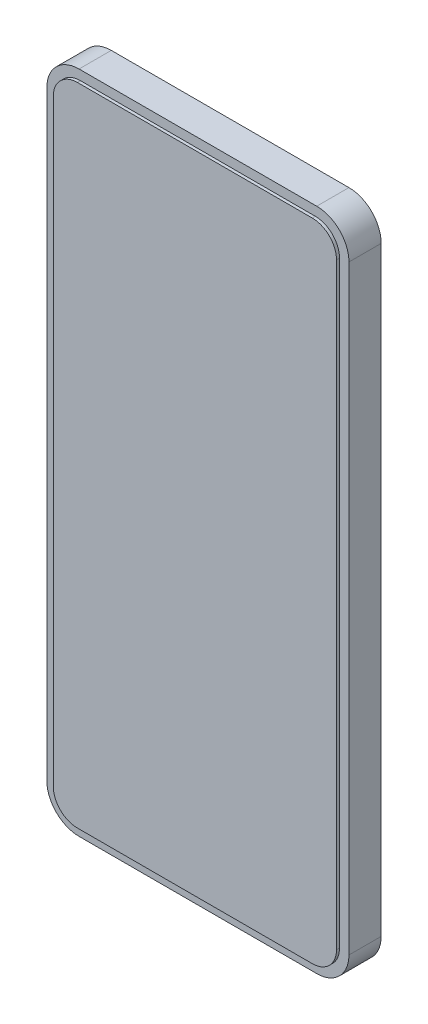
ISO-10303-21;
HEADER;
FILE_DESCRIPTION(('STEP AP214'),'2;1');
FILE_NAME('part.step','',(''),(''),'','','');
FILE_SCHEMA(('AUTOMOTIVE_DESIGN { 1 0 10303 214 1 1 1 1 }'));
ENDSEC;
DATA;
#1=APPLICATION_CONTEXT('core data for automotive mechanical design processes');
#2=APPLICATION_PROTOCOL_DEFINITION('international standard','automotive_design',2000,#1);
#3=PRODUCT_CONTEXT('',#1,'mechanical');
#4=PRODUCT('Part','Part','',(#3));
#5=PRODUCT_RELATED_PRODUCT_CATEGORY('part','',(#4));
#6=PRODUCT_DEFINITION_FORMATION('','',#4);
#7=PRODUCT_DEFINITION_CONTEXT('part definition',#1,'design');
#8=PRODUCT_DEFINITION('design','',#6,#7);
#9=PRODUCT_DEFINITION_SHAPE('','',#8);
#10=(LENGTH_UNIT() NAMED_UNIT(*) SI_UNIT(.MILLI.,.METRE.));
#11=(NAMED_UNIT(*) PLANE_ANGLE_UNIT() SI_UNIT($,.RADIAN.));
#12=(NAMED_UNIT(*) SI_UNIT($,.STERADIAN.) SOLID_ANGLE_UNIT());
#13=UNCERTAINTY_MEASURE_WITH_UNIT(LENGTH_MEASURE(1.E-05),#10,'distance_accuracy_value','');
#14=(GEOMETRIC_REPRESENTATION_CONTEXT(3) GLOBAL_UNCERTAINTY_ASSIGNED_CONTEXT((#13)) GLOBAL_UNIT_ASSIGNED_CONTEXT((#10,
#11,#12)) REPRESENTATION_CONTEXT('',''));
#15=CARTESIAN_POINT('',(0.,0.,0.));
#16=DIRECTION('',(0.,0.,1.));
#17=DIRECTION('',(1.,0.,0.));
#18=AXIS2_PLACEMENT_3D('',#15,#16,#17);
#19=CARTESIAN_POINT('',(0.,0.,8.));
#20=DIRECTION('',(0.,0.,-1.));
#21=DIRECTION('',(-1.,0.,0.));
#22=AXIS2_PLACEMENT_3D('',#19,#20,#21);
#23=PLANE('',#22);
#24=CARTESIAN_POINT('',(29.5,74.5,8.));
#25=DIRECTION('',(0.,0.,-1.));
#26=DIRECTION('',(-1.,0.,0.));
#27=AXIS2_PLACEMENT_3D('',#24,#25,#26);
#28=CIRCLE('',#27,8.);
#29=CARTESIAN_POINT('',(37.5,74.5,8.));
#30=VERTEX_POINT('',#29);
#31=CARTESIAN_POINT('',(35.1568542494924,80.1568542494924,8.));
#32=VERTEX_POINT('',#31);
#33=EDGE_CURVE('E436',#30,#32,#28,.F.);
#34=ORIENTED_EDGE('',*,*,#33,.T.);
#35=CARTESIAN_POINT('',(29.5,82.5,8.));
#36=VERTEX_POINT('',#35);
#37=EDGE_CURVE('E435',#32,#36,#28,.F.);
#38=ORIENTED_EDGE('',*,*,#37,.T.);
#39=DIRECTION('',(-1.,0.,0.));
#40=VECTOR('',#39,1.);
#41=CARTESIAN_POINT('',(-37.5,82.5,8.));
#42=LINE('',#41,#40);
#43=CARTESIAN_POINT('',(-29.5,82.5,8.));
#44=VERTEX_POINT('',#43);
#45=EDGE_CURVE('E400',#36,#44,#42,.T.);
#46=ORIENTED_EDGE('',*,*,#45,.T.);
#47=CARTESIAN_POINT('',(-29.5,74.5,8.));
#48=DIRECTION('',(0.,0.,-1.));
#49=DIRECTION('',(-1.,0.,0.));
#50=AXIS2_PLACEMENT_3D('',#47,#48,#49);
#51=CIRCLE('',#50,8.);
#52=CARTESIAN_POINT('',(-35.1568542494924,80.1568542494924,8.));
#53=VERTEX_POINT('',#52);
#54=EDGE_CURVE('E235',#44,#53,#51,.F.);
#55=ORIENTED_EDGE('',*,*,#54,.T.);
#56=CARTESIAN_POINT('',(-37.5,74.5,8.));
#57=VERTEX_POINT('',#56);
#58=EDGE_CURVE('E237',#53,#57,#51,.F.);
#59=ORIENTED_EDGE('',*,*,#58,.T.);
#60=DIRECTION('',(0.,-1.,0.));
#61=VECTOR('',#60,1.);
#62=CARTESIAN_POINT('',(-37.5,-82.5,8.));
#63=LINE('',#62,#61);
#64=CARTESIAN_POINT('',(-37.5,-74.5,8.));
#65=VERTEX_POINT('',#64);
#66=EDGE_CURVE('E404',#57,#65,#63,.T.);
#67=ORIENTED_EDGE('',*,*,#66,.T.);
#68=CARTESIAN_POINT('',(-29.5,-74.5,8.));
#69=DIRECTION('',(0.,0.,-1.));
#70=DIRECTION('',(-1.,0.,0.));
#71=AXIS2_PLACEMENT_3D('',#68,#69,#70);
#72=CIRCLE('',#71,8.);
#73=CARTESIAN_POINT('',(-35.1568542494924,-80.1568542494924,8.));
#74=VERTEX_POINT('',#73);
#75=EDGE_CURVE('E241',#65,#74,#72,.F.);
#76=ORIENTED_EDGE('',*,*,#75,.T.);
#77=CARTESIAN_POINT('',(-29.5,-82.5,8.));
#78=VERTEX_POINT('',#77);
#79=EDGE_CURVE('E229',#74,#78,#72,.F.);
#80=ORIENTED_EDGE('',*,*,#79,.T.);
#81=DIRECTION('',(1.,0.,0.));
#82=VECTOR('',#81,1.);
#83=CARTESIAN_POINT('',(-37.5,-82.5,8.));
#84=LINE('',#83,#82);
#85=CARTESIAN_POINT('',(29.5,-82.5,8.));
#86=VERTEX_POINT('',#85);
#87=EDGE_CURVE('E226',#78,#86,#84,.T.);
#88=ORIENTED_EDGE('',*,*,#87,.T.);
#89=CARTESIAN_POINT('',(29.5,-74.5,8.));
#90=DIRECTION('',(0.,0.,-1.));
#91=DIRECTION('',(-1.,0.,0.));
#92=AXIS2_PLACEMENT_3D('',#89,#90,#91);
#93=CIRCLE('',#92,8.);
#94=CARTESIAN_POINT('',(35.1568542494924,-80.1568542494924,8.));
#95=VERTEX_POINT('',#94);
#96=EDGE_CURVE('E218',#86,#95,#93,.F.);
#97=ORIENTED_EDGE('',*,*,#96,.T.);
#98=CARTESIAN_POINT('',(37.5,-74.5,8.));
#99=VERTEX_POINT('',#98);
#100=EDGE_CURVE('E223',#95,#99,#93,.F.);
#101=ORIENTED_EDGE('',*,*,#100,.T.);
#102=DIRECTION('',(0.,1.,0.));
#103=VECTOR('',#102,1.);
#104=CARTESIAN_POINT('',(37.5,-82.5,8.));
#105=LINE('',#104,#103);
#106=EDGE_CURVE('E398',#99,#30,#105,.T.);
#107=ORIENTED_EDGE('',*,*,#106,.T.);
#108=EDGE_LOOP('',(#34,#38,#46,#55,#59,#67,#76,#80,#88,#97,#101,#107));
#109=FACE_BOUND('',#108,.T.);
#110=DIRECTION('',(0.,1.,0.));
#111=VECTOR('',#110,1.);
#112=CARTESIAN_POINT('',(35.1568542494924,-80.1568542494924,8.));
#113=LINE('',#112,#111);
#114=CARTESIAN_POINT('',(35.1568542494924,-74.1568542494924,8.));
#115=VERTEX_POINT('',#114);
#116=CARTESIAN_POINT('',(35.1568542494924,74.1568542494924,8.));
#117=VERTEX_POINT('',#116);
#118=EDGE_CURVE('E59',#115,#117,#113,.T.);
#119=ORIENTED_EDGE('',*,*,#118,.F.);
#120=CARTESIAN_POINT('',(29.1568542494924,-74.1568542494924,8.));
#121=DIRECTION('',(0.,0.,-1.));
#122=DIRECTION('',(-1.,0.,0.));
#123=AXIS2_PLACEMENT_3D('',#120,#121,#122);
#124=CIRCLE('',#123,6.);
#125=CARTESIAN_POINT('',(29.1568542494924,-80.1568542494924,8.));
#126=VERTEX_POINT('',#125);
#127=EDGE_CURVE('E317',#115,#126,#124,.T.);
#128=ORIENTED_EDGE('',*,*,#127,.T.);
#129=DIRECTION('',(1.,0.,0.));
#130=VECTOR('',#129,1.);
#131=CARTESIAN_POINT('',(35.1568542494924,-80.1568542494924,8.));
#132=LINE('',#131,#130);
#133=CARTESIAN_POINT('',(-29.1568542494924,-80.1568542494924,8.));
#134=VERTEX_POINT('',#133);
#135=EDGE_CURVE('E348',#134,#126,#132,.T.);
#136=ORIENTED_EDGE('',*,*,#135,.F.);
#137=CARTESIAN_POINT('',(-29.1568542494924,-74.1568542494924,8.));
#138=DIRECTION('',(0.,0.,-1.));
#139=DIRECTION('',(-1.,0.,0.));
#140=AXIS2_PLACEMENT_3D('',#137,#138,#139);
#141=CIRCLE('',#140,6.);
#142=CARTESIAN_POINT('',(-35.1568542494924,-74.1568542494924,8.));
#143=VERTEX_POINT('',#142);
#144=EDGE_CURVE('E314',#134,#143,#141,.T.);
#145=ORIENTED_EDGE('',*,*,#144,.T.);
#146=DIRECTION('',(0.,-1.,0.));
#147=VECTOR('',#146,1.);
#148=CARTESIAN_POINT('',(-35.1568542494924,-80.1568542494924,8.));
#149=LINE('',#148,#147);
#150=CARTESIAN_POINT('',(-35.1568542494924,74.1568542494924,8.));
#151=VERTEX_POINT('',#150);
#152=EDGE_CURVE('E321',#151,#143,#149,.T.);
#153=ORIENTED_EDGE('',*,*,#152,.F.);
#154=CARTESIAN_POINT('',(-29.1568542494924,74.1568542494924,8.));
#155=DIRECTION('',(0.,0.,-1.));
#156=DIRECTION('',(-1.,0.,0.));
#157=AXIS2_PLACEMENT_3D('',#154,#155,#156);
#158=CIRCLE('',#157,6.);
#159=CARTESIAN_POINT('',(-29.1568542494924,80.1568542494924,8.));
#160=VERTEX_POINT('',#159);
#161=EDGE_CURVE('E52',#151,#160,#158,.T.);
#162=ORIENTED_EDGE('',*,*,#161,.T.);
#163=DIRECTION('',(-1.,0.,0.));
#164=VECTOR('',#163,1.);
#165=CARTESIAN_POINT('',(35.1568542494924,80.1568542494924,8.));
#166=LINE('',#165,#164);
#167=CARTESIAN_POINT('',(29.1568542494924,80.1568542494924,8.));
#168=VERTEX_POINT('',#167);
#169=EDGE_CURVE('E66',#168,#160,#166,.T.);
#170=ORIENTED_EDGE('',*,*,#169,.F.);
#171=CARTESIAN_POINT('',(29.1568542494924,74.1568542494924,8.));
#172=DIRECTION('',(0.,0.,-1.));
#173=DIRECTION('',(-1.,0.,0.));
#174=AXIS2_PLACEMENT_3D('',#171,#172,#173);
#175=CIRCLE('',#174,6.);
#176=EDGE_CURVE('E11',#168,#117,#175,.T.);
#177=ORIENTED_EDGE('',*,*,#176,.T.);
#178=EDGE_LOOP('',(#119,#128,#136,#145,#153,#162,#170,#177));
#179=FACE_BOUND('',#178,.T.);
#180=ADVANCED_FACE('F44',(#109,#179),#23,.F.);
#181=CARTESIAN_POINT('',(0.,0.,0.));
#182=DIRECTION('',(0.,0.,-1.));
#183=DIRECTION('',(-1.,0.,0.));
#184=AXIS2_PLACEMENT_3D('',#181,#182,#183);
#185=PLANE('',#184);
#186=DIRECTION('',(1.,0.,0.));
#187=VECTOR('',#186,1.);
#188=CARTESIAN_POINT('',(-37.5,-82.5,0.));
#189=LINE('',#188,#187);
#190=CARTESIAN_POINT('',(-29.5,-82.5,0.));
#191=VERTEX_POINT('',#190);
#192=CARTESIAN_POINT('',(29.5,-82.5,0.));
#193=VERTEX_POINT('',#192);
#194=EDGE_CURVE('E401',#191,#193,#189,.T.);
#195=ORIENTED_EDGE('',*,*,#194,.F.);
#196=CARTESIAN_POINT('',(-29.5,-74.5,0.));
#197=DIRECTION('',(0.,0.,-1.));
#198=DIRECTION('',(-1.,0.,0.));
#199=AXIS2_PLACEMENT_3D('',#196,#197,#198);
#200=CIRCLE('',#199,8.);
#201=CARTESIAN_POINT('',(-37.5,-74.5,0.));
#202=VERTEX_POINT('',#201);
#203=EDGE_CURVE('E429',#191,#202,#200,.T.);
#204=ORIENTED_EDGE('',*,*,#203,.T.);
#205=DIRECTION('',(0.,-1.,0.));
#206=VECTOR('',#205,1.);
#207=CARTESIAN_POINT('',(-37.5,-82.5,0.));
#208=LINE('',#207,#206);
#209=CARTESIAN_POINT('',(-37.5,74.5,0.));
#210=VERTEX_POINT('',#209);
#211=EDGE_CURVE('E414',#210,#202,#208,.T.);
#212=ORIENTED_EDGE('',*,*,#211,.F.);
#213=CARTESIAN_POINT('',(-29.5,74.5,0.));
#214=DIRECTION('',(0.,0.,-1.));
#215=DIRECTION('',(-1.,0.,0.));
#216=AXIS2_PLACEMENT_3D('',#213,#214,#215);
#217=CIRCLE('',#216,8.);
#218=CARTESIAN_POINT('',(-29.5,82.5,0.));
#219=VERTEX_POINT('',#218);
#220=EDGE_CURVE('E425',#210,#219,#217,.T.);
#221=ORIENTED_EDGE('',*,*,#220,.T.);
#222=DIRECTION('',(-1.,0.,0.));
#223=VECTOR('',#222,1.);
#224=CARTESIAN_POINT('',(-37.5,82.5,0.));
#225=LINE('',#224,#223);
#226=CARTESIAN_POINT('',(29.5,82.5,0.));
#227=VERTEX_POINT('',#226);
#228=EDGE_CURVE('E411',#227,#219,#225,.T.);
#229=ORIENTED_EDGE('',*,*,#228,.F.);
#230=CARTESIAN_POINT('',(29.5,74.5,0.));
#231=DIRECTION('',(0.,0.,-1.));
#232=DIRECTION('',(-1.,0.,0.));
#233=AXIS2_PLACEMENT_3D('',#230,#231,#232);
#234=CIRCLE('',#233,8.);
#235=CARTESIAN_POINT('',(37.5,74.5,0.));
#236=VERTEX_POINT('',#235);
#237=EDGE_CURVE('E423',#227,#236,#234,.T.);
#238=ORIENTED_EDGE('',*,*,#237,.T.);
#239=DIRECTION('',(0.,1.,0.));
#240=VECTOR('',#239,1.);
#241=CARTESIAN_POINT('',(37.5,-82.5,0.));
#242=LINE('',#241,#240);
#243=CARTESIAN_POINT('',(37.5,-74.5,0.));
#244=VERTEX_POINT('',#243);
#245=EDGE_CURVE('E387',#244,#236,#242,.T.);
#246=ORIENTED_EDGE('',*,*,#245,.F.);
#247=CARTESIAN_POINT('',(29.5,-74.5,0.));
#248=DIRECTION('',(0.,0.,-1.));
#249=DIRECTION('',(-1.,0.,0.));
#250=AXIS2_PLACEMENT_3D('',#247,#248,#249);
#251=CIRCLE('',#250,8.);
#252=EDGE_CURVE('E427',#244,#193,#251,.T.);
#253=ORIENTED_EDGE('',*,*,#252,.T.);
#254=EDGE_LOOP('',(#195,#204,#212,#221,#229,#238,#246,#253));
#255=FACE_BOUND('',#254,.T.);
#256=DIRECTION('',(1.,0.,0.));
#257=VECTOR('',#256,1.);
#258=CARTESIAN_POINT('',(30.5,75.5,0.));
#259=LINE('',#258,#257);
#260=CARTESIAN_POINT('',(14.5,75.5,0.));
#261=VERTEX_POINT('',#260);
#262=CARTESIAN_POINT('',(24.5,75.5,0.));
#263=VERTEX_POINT('',#262);
#264=EDGE_CURVE('E390',#261,#263,#259,.T.);
#265=ORIENTED_EDGE('',*,*,#264,.F.);
#266=CARTESIAN_POINT('',(14.5,69.5,0.));
#267=DIRECTION('',(0.,0.,-1.));
#268=DIRECTION('',(-1.,0.,0.));
#269=AXIS2_PLACEMENT_3D('',#266,#267,#268);
#270=CIRCLE('',#269,6.);
#271=CARTESIAN_POINT('',(8.5,69.5,0.));
#272=VERTEX_POINT('',#271);
#273=EDGE_CURVE('E286',#261,#272,#270,.F.);
#274=ORIENTED_EDGE('',*,*,#273,.T.);
#275=DIRECTION('',(0.,1.,0.));
#276=VECTOR('',#275,1.);
#277=CARTESIAN_POINT('',(8.5,75.5,0.));
#278=LINE('',#277,#276);
#279=CARTESIAN_POINT('',(8.5,46.5,0.));
#280=VERTEX_POINT('',#279);
#281=EDGE_CURVE('E371',#280,#272,#278,.T.);
#282=ORIENTED_EDGE('',*,*,#281,.F.);
#283=CARTESIAN_POINT('',(14.5,46.5,0.));
#284=DIRECTION('',(0.,0.,-1.));
#285=DIRECTION('',(-1.,0.,0.));
#286=AXIS2_PLACEMENT_3D('',#283,#284,#285);
#287=CIRCLE('',#286,6.);
#288=CARTESIAN_POINT('',(14.5,40.5,0.));
#289=VERTEX_POINT('',#288);
#290=EDGE_CURVE('E282',#280,#289,#287,.F.);
#291=ORIENTED_EDGE('',*,*,#290,.T.);
#292=DIRECTION('',(-1.,0.,0.));
#293=VECTOR('',#292,1.);
#294=CARTESIAN_POINT('',(30.5,40.5,0.));
#295=LINE('',#294,#293);
#296=CARTESIAN_POINT('',(24.5,40.5,0.));
#297=VERTEX_POINT('',#296);
#298=EDGE_CURVE('E378',#297,#289,#295,.T.);
#299=ORIENTED_EDGE('',*,*,#298,.F.);
#300=CARTESIAN_POINT('',(24.5,46.5,0.));
#301=DIRECTION('',(0.,0.,-1.));
#302=DIRECTION('',(-1.,0.,0.));
#303=AXIS2_PLACEMENT_3D('',#300,#301,#302);
#304=CIRCLE('',#303,6.);
#305=CARTESIAN_POINT('',(30.5,46.5,0.));
#306=VERTEX_POINT('',#305);
#307=EDGE_CURVE('E280',#297,#306,#304,.F.);
#308=ORIENTED_EDGE('',*,*,#307,.T.);
#309=DIRECTION('',(0.,-1.,0.));
#310=VECTOR('',#309,1.);
#311=CARTESIAN_POINT('',(30.5,75.5,0.));
#312=LINE('',#311,#310);
#313=CARTESIAN_POINT('',(30.5,69.5,0.));
#314=VERTEX_POINT('',#313);
#315=EDGE_CURVE('E393',#314,#306,#312,.T.);
#316=ORIENTED_EDGE('',*,*,#315,.F.);
#317=CARTESIAN_POINT('',(24.5,69.5,0.));
#318=DIRECTION('',(0.,0.,-1.));
#319=DIRECTION('',(-1.,0.,0.));
#320=AXIS2_PLACEMENT_3D('',#317,#318,#319);
#321=CIRCLE('',#320,6.);
#322=EDGE_CURVE('E284',#314,#263,#321,.F.);
#323=ORIENTED_EDGE('',*,*,#322,.T.);
#324=EDGE_LOOP('',(#265,#274,#282,#291,#299,#308,#316,#323));
#325=FACE_BOUND('',#324,.T.);
#326=ADVANCED_FACE('F451',(#255,#325),#185,.T.);
#327=CARTESIAN_POINT('',(37.5,-82.5,8.));
#328=DIRECTION('',(-1.,0.,0.));
#329=DIRECTION('',(0.,0.,1.));
#330=AXIS2_PLACEMENT_3D('',#327,#328,#329);
#331=PLANE('',#330);
#332=ORIENTED_EDGE('',*,*,#106,.F.);
#333=DIRECTION('',(0.,0.,-1.));
#334=VECTOR('',#333,1.);
#335=CARTESIAN_POINT('',(37.5,-74.5,8.));
#336=LINE('',#335,#334);
#337=EDGE_CURVE('E234',#99,#244,#336,.T.);
#338=ORIENTED_EDGE('',*,*,#337,.T.);
#339=ORIENTED_EDGE('',*,*,#245,.T.);
#340=DIRECTION('',(0.,0.,-1.));
#341=VECTOR('',#340,1.);
#342=CARTESIAN_POINT('',(37.5,74.5,8.));
#343=LINE('',#342,#341);
#344=EDGE_CURVE('E244',#236,#30,#343,.F.);
#345=ORIENTED_EDGE('',*,*,#344,.T.);
#346=EDGE_LOOP('',(#332,#338,#339,#345));
#347=FACE_BOUND('',#346,.T.);
#348=ADVANCED_FACE('F454',(#347),#331,.F.);
#349=CARTESIAN_POINT('',(-37.5,82.5,8.));
#350=DIRECTION('',(0.,-1.,0.));
#351=DIRECTION('',(0.,0.,-1.));
#352=AXIS2_PLACEMENT_3D('',#349,#350,#351);
#353=PLANE('',#352);
#354=ORIENTED_EDGE('',*,*,#228,.T.);
#355=DIRECTION('',(0.,0.,-1.));
#356=VECTOR('',#355,1.);
#357=CARTESIAN_POINT('',(-29.5,82.5,8.));
#358=LINE('',#357,#356);
#359=EDGE_CURVE('E250',#219,#44,#358,.F.);
#360=ORIENTED_EDGE('',*,*,#359,.T.);
#361=ORIENTED_EDGE('',*,*,#45,.F.);
#362=DIRECTION('',(0.,0.,-1.));
#363=VECTOR('',#362,1.);
#364=CARTESIAN_POINT('',(29.5,82.5,8.));
#365=LINE('',#364,#363);
#366=EDGE_CURVE('E247',#36,#227,#365,.T.);
#367=ORIENTED_EDGE('',*,*,#366,.T.);
#368=EDGE_LOOP('',(#354,#360,#361,#367));
#369=FACE_BOUND('',#368,.T.);
#370=ADVANCED_FACE('F443',(#369),#353,.F.);
#371=CARTESIAN_POINT('',(-37.5,-82.5,8.));
#372=DIRECTION('',(1.,0.,0.));
#373=DIRECTION('',(0.,0.,-1.));
#374=AXIS2_PLACEMENT_3D('',#371,#372,#373);
#375=PLANE('',#374);
#376=ORIENTED_EDGE('',*,*,#211,.T.);
#377=DIRECTION('',(0.,0.,-1.));
#378=VECTOR('',#377,1.);
#379=CARTESIAN_POINT('',(-37.5,-74.5,8.));
#380=LINE('',#379,#378);
#381=EDGE_CURVE('E434',#202,#65,#380,.F.);
#382=ORIENTED_EDGE('',*,*,#381,.T.);
#383=ORIENTED_EDGE('',*,*,#66,.F.);
#384=DIRECTION('',(0.,0.,-1.));
#385=VECTOR('',#384,1.);
#386=CARTESIAN_POINT('',(-37.5,74.5,8.));
#387=LINE('',#386,#385);
#388=EDGE_CURVE('E431',#57,#210,#387,.T.);
#389=ORIENTED_EDGE('',*,*,#388,.T.);
#390=EDGE_LOOP('',(#376,#382,#383,#389));
#391=FACE_BOUND('',#390,.T.);
#392=ADVANCED_FACE('F461',(#391),#375,.F.);
#393=CARTESIAN_POINT('',(-37.5,-82.5,8.));
#394=DIRECTION('',(0.,1.,0.));
#395=DIRECTION('',(0.,0.,1.));
#396=AXIS2_PLACEMENT_3D('',#393,#394,#395);
#397=PLANE('',#396);
#398=ORIENTED_EDGE('',*,*,#87,.F.);
#399=DIRECTION('',(0.,0.,-1.));
#400=VECTOR('',#399,1.);
#401=CARTESIAN_POINT('',(-29.5,-82.5,8.));
#402=LINE('',#401,#400);
#403=EDGE_CURVE('E420',#78,#191,#402,.T.);
#404=ORIENTED_EDGE('',*,*,#403,.T.);
#405=ORIENTED_EDGE('',*,*,#194,.T.);
#406=DIRECTION('',(0.,0.,-1.));
#407=VECTOR('',#406,1.);
#408=CARTESIAN_POINT('',(29.5,-82.5,8.));
#409=LINE('',#408,#407);
#410=EDGE_CURVE('E408',#193,#86,#409,.F.);
#411=ORIENTED_EDGE('',*,*,#410,.T.);
#412=EDGE_LOOP('',(#398,#404,#405,#411));
#413=FACE_BOUND('',#412,.T.);
#414=ADVANCED_FACE('F473',(#413),#397,.F.);
#415=CARTESIAN_POINT('',(-29.5,-74.5,8.));
#416=DIRECTION('',(0.,0.,-1.));
#417=DIRECTION('',(-1.,0.,0.));
#418=AXIS2_PLACEMENT_3D('',#415,#416,#417);
#419=CYLINDRICAL_SURFACE('',#418,8.);
#420=ORIENTED_EDGE('',*,*,#75,.F.);
#421=ORIENTED_EDGE('',*,*,#381,.F.);
#422=ORIENTED_EDGE('',*,*,#203,.F.);
#423=ORIENTED_EDGE('',*,*,#403,.F.);
#424=ORIENTED_EDGE('',*,*,#79,.F.);
#425=EDGE_LOOP('',(#420,#421,#422,#423,#424));
#426=FACE_BOUND('',#425,.T.);
#427=ADVANCED_FACE('F476',(#426),#419,.T.);
#428=CARTESIAN_POINT('',(29.5,-74.5,8.));
#429=DIRECTION('',(0.,0.,-1.));
#430=DIRECTION('',(-1.,0.,0.));
#431=AXIS2_PLACEMENT_3D('',#428,#429,#430);
#432=CYLINDRICAL_SURFACE('',#431,8.);
#433=ORIENTED_EDGE('',*,*,#96,.F.);
#434=ORIENTED_EDGE('',*,*,#410,.F.);
#435=ORIENTED_EDGE('',*,*,#252,.F.);
#436=ORIENTED_EDGE('',*,*,#337,.F.);
#437=ORIENTED_EDGE('',*,*,#100,.F.);
#438=EDGE_LOOP('',(#433,#434,#435,#436,#437));
#439=FACE_BOUND('',#438,.T.);
#440=ADVANCED_FACE('F232',(#439),#432,.T.);
#441=CARTESIAN_POINT('',(-29.5,74.5,8.));
#442=DIRECTION('',(0.,0.,-1.));
#443=DIRECTION('',(-1.,0.,0.));
#444=AXIS2_PLACEMENT_3D('',#441,#442,#443);
#445=CYLINDRICAL_SURFACE('',#444,8.);
#446=ORIENTED_EDGE('',*,*,#54,.F.);
#447=ORIENTED_EDGE('',*,*,#359,.F.);
#448=ORIENTED_EDGE('',*,*,#220,.F.);
#449=ORIENTED_EDGE('',*,*,#388,.F.);
#450=ORIENTED_EDGE('',*,*,#58,.F.);
#451=EDGE_LOOP('',(#446,#447,#448,#449,#450));
#452=FACE_BOUND('',#451,.T.);
#453=ADVANCED_FACE('F490',(#452),#445,.T.);
#454=CARTESIAN_POINT('',(29.5,74.5,8.));
#455=DIRECTION('',(0.,0.,-1.));
#456=DIRECTION('',(-1.,0.,0.));
#457=AXIS2_PLACEMENT_3D('',#454,#455,#456);
#458=CYLINDRICAL_SURFACE('',#457,8.);
#459=ORIENTED_EDGE('',*,*,#33,.F.);
#460=ORIENTED_EDGE('',*,*,#344,.F.);
#461=ORIENTED_EDGE('',*,*,#237,.F.);
#462=ORIENTED_EDGE('',*,*,#366,.F.);
#463=ORIENTED_EDGE('',*,*,#37,.F.);
#464=EDGE_LOOP('',(#459,#460,#461,#462,#463));
#465=FACE_BOUND('',#464,.T.);
#466=ADVANCED_FACE('F446',(#465),#458,.T.);
#467=CARTESIAN_POINT('',(8.5,75.5,-1.));
#468=DIRECTION('',(1.,0.,0.));
#469=DIRECTION('',(0.,1.,0.));
#470=AXIS2_PLACEMENT_3D('',#467,#468,#469);
#471=PLANE('',#470);
#472=DIRECTION('',(0.,1.,0.));
#473=VECTOR('',#472,1.);
#474=CARTESIAN_POINT('',(8.5,75.5,-1.));
#475=LINE('',#474,#473);
#476=CARTESIAN_POINT('',(8.5,46.5,-1.));
#477=VERTEX_POINT('',#476);
#478=CARTESIAN_POINT('',(8.5,69.5,-1.));
#479=VERTEX_POINT('',#478);
#480=EDGE_CURVE('E374',#477,#479,#475,.T.);
#481=ORIENTED_EDGE('',*,*,#480,.F.);
#482=DIRECTION('',(0.,0.,1.));
#483=VECTOR('',#482,1.);
#484=CARTESIAN_POINT('',(8.5,46.5,-1.));
#485=LINE('',#484,#483);
#486=EDGE_CURVE('E272',#477,#280,#485,.T.);
#487=ORIENTED_EDGE('',*,*,#486,.T.);
#488=ORIENTED_EDGE('',*,*,#281,.T.);
#489=DIRECTION('',(0.,0.,1.));
#490=VECTOR('',#489,1.);
#491=CARTESIAN_POINT('',(8.5,69.5,-1.));
#492=LINE('',#491,#490);
#493=EDGE_CURVE('E270',#272,#479,#492,.F.);
#494=ORIENTED_EDGE('',*,*,#493,.T.);
#495=EDGE_LOOP('',(#481,#487,#488,#494));
#496=FACE_BOUND('',#495,.T.);
#497=ADVANCED_FACE('F470',(#496),#471,.F.);
#498=CARTESIAN_POINT('',(30.5,75.5,-1.));
#499=DIRECTION('',(0.,-1.,0.));
#500=DIRECTION('',(0.,0.,-1.));
#501=AXIS2_PLACEMENT_3D('',#498,#499,#500);
#502=PLANE('',#501);
#503=ORIENTED_EDGE('',*,*,#264,.T.);
#504=DIRECTION('',(0.,0.,1.));
#505=VECTOR('',#504,1.);
#506=CARTESIAN_POINT('',(24.5,75.5,-1.));
#507=LINE('',#506,#505);
#508=CARTESIAN_POINT('',(24.5,75.5,-1.));
#509=VERTEX_POINT('',#508);
#510=EDGE_CURVE('E278',#263,#509,#507,.F.);
#511=ORIENTED_EDGE('',*,*,#510,.T.);
#512=DIRECTION('',(1.,0.,0.));
#513=VECTOR('',#512,1.);
#514=CARTESIAN_POINT('',(30.5,75.5,-1.));
#515=LINE('',#514,#513);
#516=CARTESIAN_POINT('',(14.5,75.5,-1.));
#517=VERTEX_POINT('',#516);
#518=EDGE_CURVE('E377',#517,#509,#515,.T.);
#519=ORIENTED_EDGE('',*,*,#518,.F.);
#520=DIRECTION('',(0.,0.,1.));
#521=VECTOR('',#520,1.);
#522=CARTESIAN_POINT('',(14.5,75.5,-1.));
#523=LINE('',#522,#521);
#524=EDGE_CURVE('E275',#517,#261,#523,.T.);
#525=ORIENTED_EDGE('',*,*,#524,.T.);
#526=EDGE_LOOP('',(#503,#511,#519,#525));
#527=FACE_BOUND('',#526,.T.);
#528=ADVANCED_FACE('F597',(#527),#502,.F.);
#529=CARTESIAN_POINT('',(30.5,75.5,-1.));
#530=DIRECTION('',(-1.,0.,0.));
#531=DIRECTION('',(0.,-1.,0.));
#532=AXIS2_PLACEMENT_3D('',#529,#530,#531);
#533=PLANE('',#532);
#534=ORIENTED_EDGE('',*,*,#315,.T.);
#535=DIRECTION('',(0.,0.,1.));
#536=VECTOR('',#535,1.);
#537=CARTESIAN_POINT('',(30.5,46.5,-1.));
#538=LINE('',#537,#536);
#539=CARTESIAN_POINT('',(30.5,46.5,-1.));
#540=VERTEX_POINT('',#539);
#541=EDGE_CURVE('E260',#306,#540,#538,.F.);
#542=ORIENTED_EDGE('',*,*,#541,.T.);
#543=DIRECTION('',(0.,-1.,0.));
#544=VECTOR('',#543,1.);
#545=CARTESIAN_POINT('',(30.5,75.5,-1.));
#546=LINE('',#545,#544);
#547=CARTESIAN_POINT('',(30.5,69.5,-1.));
#548=VERTEX_POINT('',#547);
#549=EDGE_CURVE('E381',#548,#540,#546,.T.);
#550=ORIENTED_EDGE('',*,*,#549,.F.);
#551=DIRECTION('',(0.,0.,1.));
#552=VECTOR('',#551,1.);
#553=CARTESIAN_POINT('',(30.5,69.5,-1.));
#554=LINE('',#553,#552);
#555=EDGE_CURVE('E257',#548,#314,#554,.T.);
#556=ORIENTED_EDGE('',*,*,#555,.T.);
#557=EDGE_LOOP('',(#534,#542,#550,#556));
#558=FACE_BOUND('',#557,.T.);
#559=ADVANCED_FACE('F594',(#558),#533,.F.);
#560=CARTESIAN_POINT('',(30.5,40.5,-1.));
#561=DIRECTION('',(0.,1.,0.));
#562=DIRECTION('',(-1.,0.,0.));
#563=AXIS2_PLACEMENT_3D('',#560,#561,#562);
#564=PLANE('',#563);
#565=DIRECTION('',(-1.,0.,0.));
#566=VECTOR('',#565,1.);
#567=CARTESIAN_POINT('',(30.5,40.5,-1.));
#568=LINE('',#567,#566);
#569=CARTESIAN_POINT('',(24.5,40.5,-1.));
#570=VERTEX_POINT('',#569);
#571=CARTESIAN_POINT('',(14.5,40.5,-1.));
#572=VERTEX_POINT('',#571);
#573=EDGE_CURVE('E384',#570,#572,#568,.T.);
#574=ORIENTED_EDGE('',*,*,#573,.F.);
#575=DIRECTION('',(0.,0.,1.));
#576=VECTOR('',#575,1.);
#577=CARTESIAN_POINT('',(24.5,40.5,-1.));
#578=LINE('',#577,#576);
#579=EDGE_CURVE('E254',#570,#297,#578,.T.);
#580=ORIENTED_EDGE('',*,*,#579,.T.);
#581=ORIENTED_EDGE('',*,*,#298,.T.);
#582=DIRECTION('',(0.,0.,1.));
#583=VECTOR('',#582,1.);
#584=CARTESIAN_POINT('',(14.5,40.5,-1.));
#585=LINE('',#584,#583);
#586=EDGE_CURVE('E252',#289,#572,#585,.F.);
#587=ORIENTED_EDGE('',*,*,#586,.T.);
#588=EDGE_LOOP('',(#574,#580,#581,#587));
#589=FACE_BOUND('',#588,.T.);
#590=ADVANCED_FACE('F590',(#589),#564,.F.);
#591=CARTESIAN_POINT('',(0.,0.,-1.));
#592=DIRECTION('',(0.,0.,-1.));
#593=DIRECTION('',(-1.,0.,0.));
#594=AXIS2_PLACEMENT_3D('',#591,#592,#593);
#595=PLANE('',#594);
#596=CARTESIAN_POINT('',(13.0436803031963,68.,-1.));
#597=DIRECTION('',(0.,0.,-1.));
#598=DIRECTION('',(-1.,0.,0.));
#599=AXIS2_PLACEMENT_3D('',#596,#597,#598);
#600=CIRCLE('',#599,1.85932081780215);
#601=CARTESIAN_POINT('',(11.1843594853941,68.,-1.));
#602=VERTEX_POINT('',#601);
#603=EDGE_CURVE('E341',#602,#602,#600,.T.);
#604=ORIENTED_EDGE('',*,*,#603,.F.);
#605=EDGE_LOOP('',(#604));
#606=FACE_BOUND('',#605,.T.);
#607=CARTESIAN_POINT('',(23.0436803031963,47.,-1.));
#608=DIRECTION('',(0.,0.,-1.));
#609=DIRECTION('',(-1.,0.,0.));
#610=AXIS2_PLACEMENT_3D('',#607,#608,#609);
#611=CIRCLE('',#610,4.);
#612=CARTESIAN_POINT('',(19.0436803031963,47.,-1.));
#613=VERTEX_POINT('',#612);
#614=EDGE_CURVE('E360',#613,#613,#611,.T.);
#615=ORIENTED_EDGE('',*,*,#614,.F.);
#616=EDGE_LOOP('',(#615));
#617=FACE_BOUND('',#616,.T.);
#618=CARTESIAN_POINT('',(23.0436803031963,57.,-1.));
#619=DIRECTION('',(0.,0.,-1.));
#620=DIRECTION('',(-1.,0.,0.));
#621=AXIS2_PLACEMENT_3D('',#618,#619,#620);
#622=CIRCLE('',#621,4.);
#623=CARTESIAN_POINT('',(19.0436803031963,57.,-1.));
#624=VERTEX_POINT('',#623);
#625=EDGE_CURVE('E353',#624,#624,#622,.T.);
#626=ORIENTED_EDGE('',*,*,#625,.F.);
#627=EDGE_LOOP('',(#626));
#628=FACE_BOUND('',#627,.T.);
#629=CARTESIAN_POINT('',(23.0436803031963,68.,-1.));
#630=DIRECTION('',(0.,0.,-1.));
#631=DIRECTION('',(-1.,0.,0.));
#632=AXIS2_PLACEMENT_3D('',#629,#630,#631);
#633=CIRCLE('',#632,5.);
#634=CARTESIAN_POINT('',(18.0436803031963,68.,-1.));
#635=VERTEX_POINT('',#634);
#636=EDGE_CURVE('E356',#635,#635,#633,.T.);
#637=ORIENTED_EDGE('',*,*,#636,.F.);
#638=EDGE_LOOP('',(#637));
#639=FACE_BOUND('',#638,.T.);
#640=ORIENTED_EDGE('',*,*,#549,.T.);
#641=CARTESIAN_POINT('',(24.5,46.5,-1.));
#642=DIRECTION('',(0.,0.,-1.));
#643=DIRECTION('',(-1.,0.,0.));
#644=AXIS2_PLACEMENT_3D('',#641,#642,#643);
#645=CIRCLE('',#644,6.);
#646=EDGE_CURVE('E268',#540,#570,#645,.T.);
#647=ORIENTED_EDGE('',*,*,#646,.T.);
#648=ORIENTED_EDGE('',*,*,#573,.T.);
#649=CARTESIAN_POINT('',(14.5,46.5,-1.));
#650=DIRECTION('',(0.,0.,-1.));
#651=DIRECTION('',(-1.,0.,0.));
#652=AXIS2_PLACEMENT_3D('',#649,#650,#651);
#653=CIRCLE('',#652,6.);
#654=EDGE_CURVE('E266',#572,#477,#653,.T.);
#655=ORIENTED_EDGE('',*,*,#654,.T.);
#656=ORIENTED_EDGE('',*,*,#480,.T.);
#657=CARTESIAN_POINT('',(14.5,69.5,-1.));
#658=DIRECTION('',(0.,0.,-1.));
#659=DIRECTION('',(-1.,0.,0.));
#660=AXIS2_PLACEMENT_3D('',#657,#658,#659);
#661=CIRCLE('',#660,6.);
#662=EDGE_CURVE('E262',#479,#517,#661,.T.);
#663=ORIENTED_EDGE('',*,*,#662,.T.);
#664=ORIENTED_EDGE('',*,*,#518,.T.);
#665=CARTESIAN_POINT('',(24.5,69.5,-1.));
#666=DIRECTION('',(0.,0.,-1.));
#667=DIRECTION('',(-1.,0.,0.));
#668=AXIS2_PLACEMENT_3D('',#665,#666,#667);
#669=CIRCLE('',#668,6.);
#670=EDGE_CURVE('E264',#509,#548,#669,.T.);
#671=ORIENTED_EDGE('',*,*,#670,.T.);
#672=EDGE_LOOP('',(#640,#647,#648,#655,#656,#663,#664,#671));
#673=FACE_BOUND('',#672,.T.);
#674=ADVANCED_FACE('F504',(#606,#617,#628,#639,#673),#595,.T.);
#675=CARTESIAN_POINT('',(24.5,46.5,-1.));
#676=DIRECTION('',(0.,0.,1.));
#677=DIRECTION('',(1.,0.,0.));
#678=AXIS2_PLACEMENT_3D('',#675,#676,#677);
#679=CYLINDRICAL_SURFACE('',#678,6.);
#680=ORIENTED_EDGE('',*,*,#646,.F.);
#681=ORIENTED_EDGE('',*,*,#541,.F.);
#682=ORIENTED_EDGE('',*,*,#307,.F.);
#683=ORIENTED_EDGE('',*,*,#579,.F.);
#684=EDGE_LOOP('',(#680,#681,#682,#683));
#685=FACE_BOUND('',#684,.T.);
#686=ADVANCED_FACE('F500',(#685),#679,.T.);
#687=CARTESIAN_POINT('',(14.5,46.5,-1.));
#688=DIRECTION('',(0.,0.,1.));
#689=DIRECTION('',(1.,0.,0.));
#690=AXIS2_PLACEMENT_3D('',#687,#688,#689);
#691=CYLINDRICAL_SURFACE('',#690,6.);
#692=ORIENTED_EDGE('',*,*,#654,.F.);
#693=ORIENTED_EDGE('',*,*,#586,.F.);
#694=ORIENTED_EDGE('',*,*,#290,.F.);
#695=ORIENTED_EDGE('',*,*,#486,.F.);
#696=EDGE_LOOP('',(#692,#693,#694,#695));
#697=FACE_BOUND('',#696,.T.);
#698=ADVANCED_FACE('F503',(#697),#691,.T.);
#699=CARTESIAN_POINT('',(24.5,69.5,-1.));
#700=DIRECTION('',(0.,0.,1.));
#701=DIRECTION('',(1.,0.,0.));
#702=AXIS2_PLACEMENT_3D('',#699,#700,#701);
#703=CYLINDRICAL_SURFACE('',#702,6.);
#704=ORIENTED_EDGE('',*,*,#670,.F.);
#705=ORIENTED_EDGE('',*,*,#510,.F.);
#706=ORIENTED_EDGE('',*,*,#322,.F.);
#707=ORIENTED_EDGE('',*,*,#555,.F.);
#708=EDGE_LOOP('',(#704,#705,#706,#707));
#709=FACE_BOUND('',#708,.T.);
#710=ADVANCED_FACE('F508',(#709),#703,.T.);
#711=CARTESIAN_POINT('',(14.5,69.5,-1.));
#712=DIRECTION('',(0.,0.,1.));
#713=DIRECTION('',(1.,0.,0.));
#714=AXIS2_PLACEMENT_3D('',#711,#712,#713);
#715=CYLINDRICAL_SURFACE('',#714,6.);
#716=ORIENTED_EDGE('',*,*,#662,.F.);
#717=ORIENTED_EDGE('',*,*,#493,.F.);
#718=ORIENTED_EDGE('',*,*,#273,.F.);
#719=ORIENTED_EDGE('',*,*,#524,.F.);
#720=EDGE_LOOP('',(#716,#717,#718,#719));
#721=FACE_BOUND('',#720,.T.);
#722=ADVANCED_FACE('F512',(#721),#715,.T.);
#723=CARTESIAN_POINT('',(23.0436803031963,68.,-0.5));
#724=DIRECTION('',(0.,0.,-1.));
#725=DIRECTION('',(-1.,0.,0.));
#726=AXIS2_PLACEMENT_3D('',#723,#724,#725);
#727=CYLINDRICAL_SURFACE('',#726,5.);
#728=CARTESIAN_POINT('',(23.0436803031963,68.,-0.5));
#729=DIRECTION('',(0.,0.,-1.));
#730=DIRECTION('',(-1.,0.,0.));
#731=AXIS2_PLACEMENT_3D('',#728,#729,#730);
#732=CIRCLE('',#731,5.);
#733=CARTESIAN_POINT('',(18.0436803031963,68.,-0.5));
#734=VERTEX_POINT('',#733);
#735=EDGE_CURVE('E368',#734,#734,#732,.T.);
#736=ORIENTED_EDGE('',*,*,#735,.F.);
#737=EDGE_LOOP('',(#736));
#738=FACE_BOUND('',#737,.T.);
#739=ORIENTED_EDGE('',*,*,#636,.T.);
#740=EDGE_LOOP('',(#739));
#741=FACE_BOUND('',#740,.T.);
#742=ADVANCED_FACE('F516',(#738,#741),#727,.F.);
#743=CARTESIAN_POINT('',(23.0436803031963,68.,-0.5));
#744=DIRECTION('',(0.,0.,-1.));
#745=DIRECTION('',(-1.,0.,0.));
#746=AXIS2_PLACEMENT_3D('',#743,#744,#745);
#747=PLANE('',#746);
#748=ORIENTED_EDGE('',*,*,#735,.T.);
#749=EDGE_LOOP('',(#748));
#750=FACE_BOUND('',#749,.T.);
#751=ADVANCED_FACE('F566',(#750),#747,.T.);
#752=CARTESIAN_POINT('',(23.0436803031963,57.,-0.5));
#753=DIRECTION('',(0.,0.,-1.));
#754=DIRECTION('',(-1.,0.,0.));
#755=AXIS2_PLACEMENT_3D('',#752,#753,#754);
#756=CYLINDRICAL_SURFACE('',#755,4.);
#757=CARTESIAN_POINT('',(23.0436803031963,57.,-0.5));
#758=DIRECTION('',(0.,0.,-1.));
#759=DIRECTION('',(-1.,0.,0.));
#760=AXIS2_PLACEMENT_3D('',#757,#758,#759);
#761=CIRCLE('',#760,4.);
#762=CARTESIAN_POINT('',(19.0436803031963,57.,-0.5));
#763=VERTEX_POINT('',#762);
#764=EDGE_CURVE('E357',#763,#763,#761,.T.);
#765=ORIENTED_EDGE('',*,*,#764,.F.);
#766=EDGE_LOOP('',(#765));
#767=FACE_BOUND('',#766,.T.);
#768=ORIENTED_EDGE('',*,*,#625,.T.);
#769=EDGE_LOOP('',(#768));
#770=FACE_BOUND('',#769,.T.);
#771=ADVANCED_FACE('F562',(#767,#770),#756,.F.);
#772=CARTESIAN_POINT('',(23.0436803031963,57.,-0.5));
#773=DIRECTION('',(0.,0.,-1.));
#774=DIRECTION('',(-1.,0.,0.));
#775=AXIS2_PLACEMENT_3D('',#772,#773,#774);
#776=PLANE('',#775);
#777=ORIENTED_EDGE('',*,*,#764,.T.);
#778=EDGE_LOOP('',(#777));
#779=FACE_BOUND('',#778,.T.);
#780=ADVANCED_FACE('F565',(#779),#776,.T.);
#781=CARTESIAN_POINT('',(23.0436803031963,47.,-0.5));
#782=DIRECTION('',(0.,0.,-1.));
#783=DIRECTION('',(-1.,0.,0.));
#784=AXIS2_PLACEMENT_3D('',#781,#782,#783);
#785=CYLINDRICAL_SURFACE('',#784,4.);
#786=CARTESIAN_POINT('',(23.0436803031963,47.,-0.5));
#787=DIRECTION('',(0.,0.,-1.));
#788=DIRECTION('',(-1.,0.,0.));
#789=AXIS2_PLACEMENT_3D('',#786,#787,#788);
#790=CIRCLE('',#789,4.);
#791=CARTESIAN_POINT('',(19.0436803031963,47.,-0.5));
#792=VERTEX_POINT('',#791);
#793=EDGE_CURVE('E363',#792,#792,#790,.T.);
#794=ORIENTED_EDGE('',*,*,#793,.F.);
#795=EDGE_LOOP('',(#794));
#796=FACE_BOUND('',#795,.T.);
#797=ORIENTED_EDGE('',*,*,#614,.T.);
#798=EDGE_LOOP('',(#797));
#799=FACE_BOUND('',#798,.T.);
#800=ADVANCED_FACE('F570',(#796,#799),#785,.F.);
#801=CARTESIAN_POINT('',(23.0436803031963,47.,-0.5));
#802=DIRECTION('',(0.,0.,-1.));
#803=DIRECTION('',(-1.,0.,0.));
#804=AXIS2_PLACEMENT_3D('',#801,#802,#803);
#805=PLANE('',#804);
#806=ORIENTED_EDGE('',*,*,#793,.T.);
#807=EDGE_LOOP('',(#806));
#808=FACE_BOUND('',#807,.T.);
#809=ADVANCED_FACE('F574',(#808),#805,.T.);
#810=CARTESIAN_POINT('',(13.0436803031963,68.,-0.5));
#811=DIRECTION('',(0.,0.,-1.));
#812=DIRECTION('',(-1.,0.,0.));
#813=AXIS2_PLACEMENT_3D('',#810,#811,#812);
#814=CYLINDRICAL_SURFACE('',#813,1.85932081780215);
#815=CARTESIAN_POINT('',(13.0436803031963,68.,-0.5));
#816=DIRECTION('',(0.,0.,-1.));
#817=DIRECTION('',(-1.,0.,0.));
#818=AXIS2_PLACEMENT_3D('',#815,#816,#817);
#819=CIRCLE('',#818,1.85932081780215);
#820=CARTESIAN_POINT('',(11.1843594853941,68.,-0.5));
#821=VERTEX_POINT('',#820);
#822=EDGE_CURVE('E337',#821,#821,#819,.T.);
#823=ORIENTED_EDGE('',*,*,#822,.F.);
#824=EDGE_LOOP('',(#823));
#825=FACE_BOUND('',#824,.T.);
#826=ORIENTED_EDGE('',*,*,#603,.T.);
#827=EDGE_LOOP('',(#826));
#828=FACE_BOUND('',#827,.T.);
#829=ADVANCED_FACE('F557',(#825,#828),#814,.F.);
#830=CARTESIAN_POINT('',(13.0436803031963,68.,-0.5));
#831=DIRECTION('',(0.,0.,-1.));
#832=DIRECTION('',(-1.,0.,0.));
#833=AXIS2_PLACEMENT_3D('',#830,#831,#832);
#834=PLANE('',#833);
#835=ORIENTED_EDGE('',*,*,#822,.T.);
#836=EDGE_LOOP('',(#835));
#837=FACE_BOUND('',#836,.T.);
#838=ADVANCED_FACE('F549',(#837),#834,.T.);
#839=CARTESIAN_POINT('',(-35.1568542494924,-80.1568542494924,8.75));
#840=DIRECTION('',(1.,0.,0.));
#841=DIRECTION('',(0.,0.,-1.));
#842=AXIS2_PLACEMENT_3D('',#839,#840,#841);
#843=PLANE('',#842);
#844=ORIENTED_EDGE('',*,*,#152,.T.);
#845=DIRECTION('',(0.,0.,-1.));
#846=VECTOR('',#845,1.);
#847=CARTESIAN_POINT('',(-35.1568542494924,-74.1568542494924,8.75));
#848=LINE('',#847,#846);
#849=CARTESIAN_POINT('',(-35.1568542494924,-74.1568542494924,8.75));
#850=VERTEX_POINT('',#849);
#851=EDGE_CURVE('E296',#143,#850,#848,.F.);
#852=ORIENTED_EDGE('',*,*,#851,.T.);
#853=DIRECTION('',(0.,-1.,0.));
#854=VECTOR('',#853,1.);
#855=CARTESIAN_POINT('',(-35.1568542494924,-80.1568542494924,8.75));
#856=LINE('',#855,#854);
#857=CARTESIAN_POINT('',(-35.1568542494924,74.1568542494924,8.75));
#858=VERTEX_POINT('',#857);
#859=EDGE_CURVE('E352',#858,#850,#856,.T.);
#860=ORIENTED_EDGE('',*,*,#859,.F.);
#861=DIRECTION('',(0.,0.,-1.));
#862=VECTOR('',#861,1.);
#863=CARTESIAN_POINT('',(-35.1568542494924,74.1568542494924,8.75));
#864=LINE('',#863,#862);
#865=EDGE_CURVE('E293',#858,#151,#864,.T.);
#866=ORIENTED_EDGE('',*,*,#865,.T.);
#867=EDGE_LOOP('',(#844,#852,#860,#866));
#868=FACE_BOUND('',#867,.T.);
#869=ADVANCED_FACE('F547',(#868),#843,.F.);
#870=CARTESIAN_POINT('',(35.1568542494924,-80.1568542494924,8.75));
#871=DIRECTION('',(0.,1.,0.));
#872=DIRECTION('',(0.,0.,1.));
#873=AXIS2_PLACEMENT_3D('',#870,#871,#872);
#874=PLANE('',#873);
#875=DIRECTION('',(1.,0.,0.));
#876=VECTOR('',#875,1.);
#877=CARTESIAN_POINT('',(35.1568542494924,-80.1568542494924,8.75));
#878=LINE('',#877,#876);
#879=CARTESIAN_POINT('',(-29.1568542494924,-80.1568542494924,8.75));
#880=VERTEX_POINT('',#879);
#881=CARTESIAN_POINT('',(29.1568542494924,-80.1568542494924,8.75));
#882=VERTEX_POINT('',#881);
#883=EDGE_CURVE('E343',#880,#882,#878,.T.);
#884=ORIENTED_EDGE('',*,*,#883,.F.);
#885=DIRECTION('',(0.,0.,-1.));
#886=VECTOR('',#885,1.);
#887=CARTESIAN_POINT('',(-29.1568542494924,-80.1568542494924,8.75));
#888=LINE('',#887,#886);
#889=EDGE_CURVE('E290',#880,#134,#888,.T.);
#890=ORIENTED_EDGE('',*,*,#889,.T.);
#891=ORIENTED_EDGE('',*,*,#135,.T.);
#892=DIRECTION('',(0.,0.,-1.));
#893=VECTOR('',#892,1.);
#894=CARTESIAN_POINT('',(29.1568542494924,-80.1568542494924,8.75));
#895=LINE('',#894,#893);
#896=EDGE_CURVE('E288',#126,#882,#895,.F.);
#897=ORIENTED_EDGE('',*,*,#896,.T.);
#898=EDGE_LOOP('',(#884,#890,#891,#897));
#899=FACE_BOUND('',#898,.T.);
#900=ADVANCED_FACE('F540',(#899),#874,.F.);
#901=CARTESIAN_POINT('',(35.1568542494924,-80.1568542494924,8.75));
#902=DIRECTION('',(-1.,0.,0.));
#903=DIRECTION('',(0.,0.,1.));
#904=AXIS2_PLACEMENT_3D('',#901,#902,#903);
#905=PLANE('',#904);
#906=DIRECTION('',(0.,1.,0.));
#907=VECTOR('',#906,1.);
#908=CARTESIAN_POINT('',(35.1568542494924,-80.1568542494924,8.75));
#909=LINE('',#908,#907);
#910=CARTESIAN_POINT('',(35.1568542494924,-74.1568542494924,8.75));
#911=VERTEX_POINT('',#910);
#912=CARTESIAN_POINT('',(35.1568542494924,74.1568542494924,8.75));
#913=VERTEX_POINT('',#912);
#914=EDGE_CURVE('E338',#911,#913,#909,.T.);
#915=ORIENTED_EDGE('',*,*,#914,.F.);
#916=DIRECTION('',(0.,0.,-1.));
#917=VECTOR('',#916,1.);
#918=CARTESIAN_POINT('',(35.1568542494924,-74.1568542494924,8.75));
#919=LINE('',#918,#917);
#920=EDGE_CURVE('E308',#911,#115,#919,.T.);
#921=ORIENTED_EDGE('',*,*,#920,.T.);
#922=ORIENTED_EDGE('',*,*,#118,.T.);
#923=DIRECTION('',(0.,0.,-1.));
#924=VECTOR('',#923,1.);
#925=CARTESIAN_POINT('',(35.1568542494924,74.1568542494924,8.75));
#926=LINE('',#925,#924);
#927=EDGE_CURVE('E306',#117,#913,#926,.F.);
#928=ORIENTED_EDGE('',*,*,#927,.T.);
#929=EDGE_LOOP('',(#915,#921,#922,#928));
#930=FACE_BOUND('',#929,.T.);
#931=ADVANCED_FACE('F555',(#930),#905,.F.);
#932=CARTESIAN_POINT('',(35.1568542494924,80.1568542494924,8.75));
#933=DIRECTION('',(0.,-1.,0.));
#934=DIRECTION('',(0.,0.,-1.));
#935=AXIS2_PLACEMENT_3D('',#932,#933,#934);
#936=PLANE('',#935);
#937=ORIENTED_EDGE('',*,*,#169,.T.);
#938=DIRECTION('',(0.,0.,-1.));
#939=VECTOR('',#938,1.);
#940=CARTESIAN_POINT('',(-29.1568542494924,80.1568542494924,8.75));
#941=LINE('',#940,#939);
#942=CARTESIAN_POINT('',(-29.1568542494924,80.1568542494924,8.75));
#943=VERTEX_POINT('',#942);
#944=EDGE_CURVE('E312',#160,#943,#941,.F.);
#945=ORIENTED_EDGE('',*,*,#944,.T.);
#946=DIRECTION('',(-1.,0.,0.));
#947=VECTOR('',#946,1.);
#948=CARTESIAN_POINT('',(35.1568542494924,80.1568542494924,8.75));
#949=LINE('',#948,#947);
#950=CARTESIAN_POINT('',(29.1568542494924,80.1568542494924,8.75));
#951=VERTEX_POINT('',#950);
#952=EDGE_CURVE('E329',#951,#943,#949,.T.);
#953=ORIENTED_EDGE('',*,*,#952,.F.);
#954=DIRECTION('',(0.,0.,-1.));
#955=VECTOR('',#954,1.);
#956=CARTESIAN_POINT('',(29.1568542494924,80.1568542494924,8.75));
#957=LINE('',#956,#955);
#958=EDGE_CURVE('E310',#951,#168,#957,.T.);
#959=ORIENTED_EDGE('',*,*,#958,.T.);
#960=EDGE_LOOP('',(#937,#945,#953,#959));
#961=FACE_BOUND('',#960,.T.);
#962=ADVANCED_FACE('F328',(#961),#936,.F.);
#963=CARTESIAN_POINT('',(0.,0.,8.75));
#964=DIRECTION('',(0.,0.,1.));
#965=DIRECTION('',(1.,0.,0.));
#966=AXIS2_PLACEMENT_3D('',#963,#964,#965);
#967=PLANE('',#966);
#968=ORIENTED_EDGE('',*,*,#859,.T.);
#969=CARTESIAN_POINT('',(-29.1568542494924,-74.1568542494924,8.75));
#970=DIRECTION('',(0.,0.,1.));
#971=DIRECTION('',(1.,0.,0.));
#972=AXIS2_PLACEMENT_3D('',#969,#970,#971);
#973=CIRCLE('',#972,6.);
#974=EDGE_CURVE('E304',#850,#880,#973,.T.);
#975=ORIENTED_EDGE('',*,*,#974,.T.);
#976=ORIENTED_EDGE('',*,*,#883,.T.);
#977=CARTESIAN_POINT('',(29.1568542494924,-74.1568542494924,8.75));
#978=DIRECTION('',(0.,0.,1.));
#979=DIRECTION('',(1.,0.,0.));
#980=AXIS2_PLACEMENT_3D('',#977,#978,#979);
#981=CIRCLE('',#980,6.);
#982=EDGE_CURVE('E302',#882,#911,#981,.T.);
#983=ORIENTED_EDGE('',*,*,#982,.T.);
#984=ORIENTED_EDGE('',*,*,#914,.T.);
#985=CARTESIAN_POINT('',(29.1568542494924,74.1568542494924,8.75));
#986=DIRECTION('',(0.,0.,1.));
#987=DIRECTION('',(1.,0.,0.));
#988=AXIS2_PLACEMENT_3D('',#985,#986,#987);
#989=CIRCLE('',#988,6.);
#990=EDGE_CURVE('E298',#913,#951,#989,.T.);
#991=ORIENTED_EDGE('',*,*,#990,.T.);
#992=ORIENTED_EDGE('',*,*,#952,.T.);
#993=CARTESIAN_POINT('',(-29.1568542494924,74.1568542494924,8.75));
#994=DIRECTION('',(0.,0.,1.));
#995=DIRECTION('',(1.,0.,0.));
#996=AXIS2_PLACEMENT_3D('',#993,#994,#995);
#997=CIRCLE('',#996,6.);
#998=EDGE_CURVE('E300',#943,#858,#997,.T.);
#999=ORIENTED_EDGE('',*,*,#998,.T.);
#1000=EDGE_LOOP('',(#968,#975,#976,#983,#984,#991,#992,#999));
#1001=FACE_BOUND('',#1000,.T.);
#1002=ADVANCED_FACE('F333',(#1001),#967,.T.);
#1003=CARTESIAN_POINT('',(-29.1568542494924,-74.1568542494924,8.75));
#1004=DIRECTION('',(0.,0.,-1.));
#1005=DIRECTION('',(-1.,0.,0.));
#1006=AXIS2_PLACEMENT_3D('',#1003,#1004,#1005);
#1007=CYLINDRICAL_SURFACE('',#1006,6.);
#1008=ORIENTED_EDGE('',*,*,#974,.F.);
#1009=ORIENTED_EDGE('',*,*,#851,.F.);
#1010=ORIENTED_EDGE('',*,*,#144,.F.);
#1011=ORIENTED_EDGE('',*,*,#889,.F.);
#1012=EDGE_LOOP('',(#1008,#1009,#1010,#1011));
#1013=FACE_BOUND('',#1012,.T.);
#1014=ADVANCED_FACE('F518',(#1013),#1007,.T.);
#1015=CARTESIAN_POINT('',(29.1568542494924,-74.1568542494924,8.75));
#1016=DIRECTION('',(0.,0.,-1.));
#1017=DIRECTION('',(-1.,0.,0.));
#1018=AXIS2_PLACEMENT_3D('',#1015,#1016,#1017);
#1019=CYLINDRICAL_SURFACE('',#1018,6.);
#1020=ORIENTED_EDGE('',*,*,#982,.F.);
#1021=ORIENTED_EDGE('',*,*,#896,.F.);
#1022=ORIENTED_EDGE('',*,*,#127,.F.);
#1023=ORIENTED_EDGE('',*,*,#920,.F.);
#1024=EDGE_LOOP('',(#1020,#1021,#1022,#1023));
#1025=FACE_BOUND('',#1024,.T.);
#1026=ADVANCED_FACE('F521',(#1025),#1019,.T.);
#1027=CARTESIAN_POINT('',(-29.1568542494924,74.1568542494924,8.75));
#1028=DIRECTION('',(0.,0.,-1.));
#1029=DIRECTION('',(-1.,0.,0.));
#1030=AXIS2_PLACEMENT_3D('',#1027,#1028,#1029);
#1031=CYLINDRICAL_SURFACE('',#1030,6.);
#1032=ORIENTED_EDGE('',*,*,#998,.F.);
#1033=ORIENTED_EDGE('',*,*,#944,.F.);
#1034=ORIENTED_EDGE('',*,*,#161,.F.);
#1035=ORIENTED_EDGE('',*,*,#865,.F.);
#1036=EDGE_LOOP('',(#1032,#1033,#1034,#1035));
#1037=FACE_BOUND('',#1036,.T.);
#1038=ADVANCED_FACE('F325',(#1037),#1031,.T.);
#1039=CARTESIAN_POINT('',(29.1568542494924,74.1568542494924,8.75));
#1040=DIRECTION('',(0.,0.,-1.));
#1041=DIRECTION('',(-1.,0.,0.));
#1042=AXIS2_PLACEMENT_3D('',#1039,#1040,#1041);
#1043=CYLINDRICAL_SURFACE('',#1042,6.);
#1044=ORIENTED_EDGE('',*,*,#990,.F.);
#1045=ORIENTED_EDGE('',*,*,#927,.F.);
#1046=ORIENTED_EDGE('',*,*,#176,.F.);
#1047=ORIENTED_EDGE('',*,*,#958,.F.);
#1048=EDGE_LOOP('',(#1044,#1045,#1046,#1047));
#1049=FACE_BOUND('',#1048,.T.);
#1050=ADVANCED_FACE('F46',(#1049),#1043,.T.);
#1051=CLOSED_SHELL('',(#180,#326,#348,#370,#392,#414,#427,#440,#453,#466,#497,#528,#559,#590,
#674,#686,#698,#710,#722,#742,#751,#771,#780,#800,#809,#829,#838,#869,#900,#931,#962,#1002,
#1014,#1026,#1038,#1050));
#1052=MANIFOLD_SOLID_BREP('B2',#1051);
#1053=ADVANCED_BREP_SHAPE_REPRESENTATION('',(#18,#1052),#14);
#1054=SHAPE_DEFINITION_REPRESENTATION(#9,#1053);
ENDSEC;
END-ISO-10303-21;
